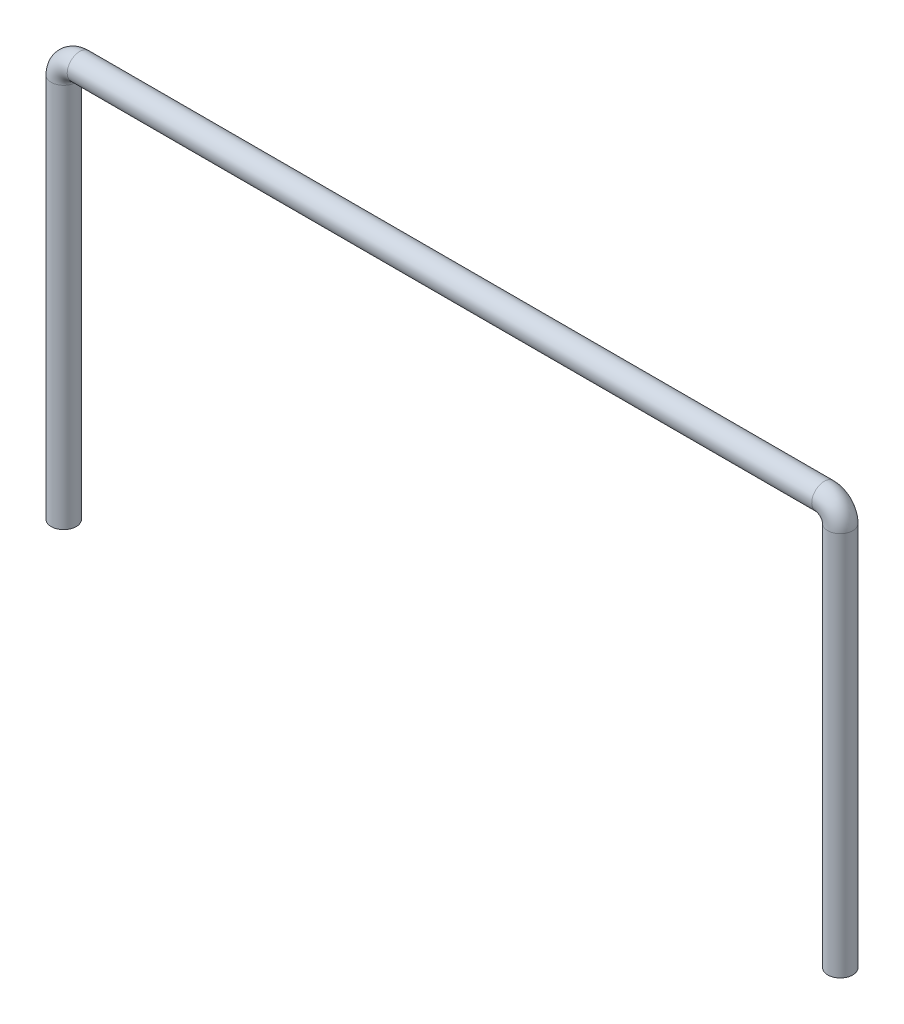
ISO-10303-21;
HEADER;
FILE_DESCRIPTION(('STEP AP214'),'2;1');
FILE_NAME('part.step','',(''),(''),'','','');
FILE_SCHEMA(('AUTOMOTIVE_DESIGN { 1 0 10303 214 1 1 1 1 }'));
ENDSEC;
DATA;
#1=APPLICATION_CONTEXT('core data for automotive mechanical design processes');
#2=APPLICATION_PROTOCOL_DEFINITION('international standard','automotive_design',2000,#1);
#3=PRODUCT_CONTEXT('',#1,'mechanical');
#4=PRODUCT('Part','Part','',(#3));
#5=PRODUCT_RELATED_PRODUCT_CATEGORY('part','',(#4));
#6=PRODUCT_DEFINITION_FORMATION('','',#4);
#7=PRODUCT_DEFINITION_CONTEXT('part definition',#1,'design');
#8=PRODUCT_DEFINITION('design','',#6,#7);
#9=PRODUCT_DEFINITION_SHAPE('','',#8);
#10=(LENGTH_UNIT() NAMED_UNIT(*) SI_UNIT(.MILLI.,.METRE.));
#11=(NAMED_UNIT(*) PLANE_ANGLE_UNIT() SI_UNIT($,.RADIAN.));
#12=(NAMED_UNIT(*) SI_UNIT($,.STERADIAN.) SOLID_ANGLE_UNIT());
#13=UNCERTAINTY_MEASURE_WITH_UNIT(LENGTH_MEASURE(1.E-05),#10,'distance_accuracy_value','');
#14=(GEOMETRIC_REPRESENTATION_CONTEXT(3) GLOBAL_UNCERTAINTY_ASSIGNED_CONTEXT((#13)) GLOBAL_UNIT_ASSIGNED_CONTEXT((#10,
#11,#12)) REPRESENTATION_CONTEXT('',''));
#15=CARTESIAN_POINT('',(0.,0.,0.));
#16=DIRECTION('',(0.,0.,1.));
#17=DIRECTION('',(1.,0.,0.));
#18=AXIS2_PLACEMENT_3D('',#15,#16,#17);
#19=CARTESIAN_POINT('',(-6.1515625,-6.35,0.));
#20=DIRECTION('',(0.,1.,0.));
#21=DIRECTION('',(0.,0.,1.));
#22=AXIS2_PLACEMENT_3D('',#19,#20,#21);
#23=PLANE('',#22);
#24=CARTESIAN_POINT('',(-6.1515625,-6.35,0.));
#25=DIRECTION('',(0.,1.,0.));
#26=DIRECTION('',(0.,0.,1.));
#27=AXIS2_PLACEMENT_3D('',#24,#25,#26);
#28=CIRCLE('',#27,0.1984375);
#29=CARTESIAN_POINT('',(-6.1515625,-6.35,0.1984375));
#30=VERTEX_POINT('',#29);
#31=EDGE_CURVE('E53',#30,#30,#28,.T.);
#32=ORIENTED_EDGE('',*,*,#31,.F.);
#33=EDGE_LOOP('',(#32));
#34=FACE_BOUND('',#33,.T.);
#35=ADVANCED_FACE('F31',(#34),#23,.F.);
#36=CARTESIAN_POINT('',(6.1515625,-6.35,0.));
#37=DIRECTION('',(0.,-1.,0.));
#38=DIRECTION('',(0.,0.,1.));
#39=AXIS2_PLACEMENT_3D('',#36,#37,#38);
#40=PLANE('',#39);
#41=CARTESIAN_POINT('',(6.1515625,-6.35,0.));
#42=DIRECTION('',(0.,-1.,0.));
#43=DIRECTION('',(0.,0.,1.));
#44=AXIS2_PLACEMENT_3D('',#41,#42,#43);
#45=CIRCLE('',#44,0.1984375);
#46=CARTESIAN_POINT('',(6.1515625,-6.35,0.1984375));
#47=VERTEX_POINT('',#46);
#48=EDGE_CURVE('E10',#47,#47,#45,.T.);
#49=ORIENTED_EDGE('',*,*,#48,.T.);
#50=EDGE_LOOP('',(#49));
#51=FACE_BOUND('',#50,.T.);
#52=ADVANCED_FACE('F60',(#51),#40,.T.);
#53=CARTESIAN_POINT('',(-6.1515625,-6.35,0.));
#54=DIRECTION('',(0.,1.,0.));
#55=DIRECTION('',(0.,0.,1.));
#56=AXIS2_PLACEMENT_3D('',#53,#54,#55);
#57=CYLINDRICAL_SURFACE('',#56,0.1984375);
#58=CARTESIAN_POINT('',(-6.1515625,-0.254000000000002,0.));
#59=DIRECTION('',(0.,1.,0.));
#60=DIRECTION('',(0.,0.,1.));
#61=AXIS2_PLACEMENT_3D('',#58,#59,#60);
#62=CIRCLE('',#61,0.1984375);
#63=CARTESIAN_POINT('',(-6.35,-0.254000000000002,0.));
#64=VERTEX_POINT('',#63);
#65=EDGE_CURVE('E50',#64,#64,#62,.T.);
#66=ORIENTED_EDGE('',*,*,#65,.F.);
#67=EDGE_LOOP('',(#66));
#68=FACE_BOUND('',#67,.T.);
#69=ORIENTED_EDGE('',*,*,#31,.T.);
#70=EDGE_LOOP('',(#69));
#71=FACE_BOUND('',#70,.T.);
#72=ADVANCED_FACE('F57',(#68,#71),#57,.T.);
#73=CARTESIAN_POINT('',(-5.8975625,-0.254000000000001,0.));
#74=DIRECTION('',(0.,0.,-1.));
#75=DIRECTION('',(-1.,0.,0.));
#76=AXIS2_PLACEMENT_3D('',#73,#74,#75);
#77=TOROIDAL_SURFACE('',#76,0.253999999999998,0.1984375);
#78=CARTESIAN_POINT('',(-5.8975625,0.,0.));
#79=DIRECTION('',(1.,0.,0.));
#80=DIRECTION('',(0.,0.,1.));
#81=AXIS2_PLACEMENT_3D('',#78,#79,#80);
#82=CIRCLE('',#81,0.1984375);
#83=CARTESIAN_POINT('',(-5.8975625,0.198437499999997,0.));
#84=VERTEX_POINT('',#83);
#85=EDGE_CURVE('E45',#84,#84,#82,.T.);
#86=CARTESIAN_POINT('',(-5.8975625,-0.254000000000001,0.));
#87=DIRECTION('',(0.,0.,-1.));
#88=DIRECTION('',(-1.,0.,0.));
#89=AXIS2_PLACEMENT_3D('',#86,#87,#88);
#90=CIRCLE('',#89,0.452437499999998);
#91=EDGE_CURVE('',#64,#84,#90,.T.);
#92=ORIENTED_EDGE('',*,*,#65,.T.);
#93=ORIENTED_EDGE('',*,*,#85,.F.);
#94=ORIENTED_EDGE('',*,*,#91,.T.);
#95=ORIENTED_EDGE('',*,*,#91,.F.);
#96=EDGE_LOOP('',(#92,#94,#93,#95));
#97=FACE_BOUND('',#96,.T.);
#98=ADVANCED_FACE('F78',(#97),#77,.T.);
#99=CARTESIAN_POINT('',(-5.8975625,0.,0.));
#100=DIRECTION('',(1.,0.,0.));
#101=DIRECTION('',(0.,0.,-1.));
#102=AXIS2_PLACEMENT_3D('',#99,#100,#101);
#103=CYLINDRICAL_SURFACE('',#102,0.1984375);
#104=CARTESIAN_POINT('',(5.8975625,0.,0.));
#105=DIRECTION('',(1.,0.,0.));
#106=DIRECTION('',(0.,0.,1.));
#107=AXIS2_PLACEMENT_3D('',#104,#105,#106);
#108=CIRCLE('',#107,0.1984375);
#109=CARTESIAN_POINT('',(5.8975625,0.198437499999998,0.));
#110=VERTEX_POINT('',#109);
#111=EDGE_CURVE('E41',#110,#110,#108,.T.);
#112=ORIENTED_EDGE('',*,*,#111,.F.);
#113=EDGE_LOOP('',(#112));
#114=FACE_BOUND('',#113,.T.);
#115=ORIENTED_EDGE('',*,*,#85,.T.);
#116=EDGE_LOOP('',(#115));
#117=FACE_BOUND('',#116,.T.);
#118=ADVANCED_FACE('F72',(#114,#117),#103,.T.);
#119=CARTESIAN_POINT('',(5.8975625,-0.254000000000001,0.));
#120=DIRECTION('',(0.,0.,-1.));
#121=DIRECTION('',(-1.,0.,0.));
#122=AXIS2_PLACEMENT_3D('',#119,#120,#121);
#123=TOROIDAL_SURFACE('',#122,0.254,0.1984375);
#124=CARTESIAN_POINT('',(6.1515625,-0.254000000000002,0.));
#125=DIRECTION('',(0.,-1.,0.));
#126=DIRECTION('',(0.,0.,1.));
#127=AXIS2_PLACEMENT_3D('',#124,#125,#126);
#128=CIRCLE('',#127,0.1984375);
#129=CARTESIAN_POINT('',(6.35,-0.254000000000002,0.));
#130=VERTEX_POINT('',#129);
#131=EDGE_CURVE('E37',#130,#130,#128,.T.);
#132=CARTESIAN_POINT('',(5.8975625,-0.254000000000001,0.));
#133=DIRECTION('',(0.,0.,-1.));
#134=DIRECTION('',(-1.,0.,0.));
#135=AXIS2_PLACEMENT_3D('',#132,#133,#134);
#136=CIRCLE('',#135,0.4524375);
#137=EDGE_CURVE('',#110,#130,#136,.T.);
#138=ORIENTED_EDGE('',*,*,#111,.T.);
#139=ORIENTED_EDGE('',*,*,#131,.F.);
#140=ORIENTED_EDGE('',*,*,#137,.T.);
#141=ORIENTED_EDGE('',*,*,#137,.F.);
#142=EDGE_LOOP('',(#138,#140,#139,#141));
#143=FACE_BOUND('',#142,.T.);
#144=ADVANCED_FACE('F66',(#143),#123,.T.);
#145=CARTESIAN_POINT('',(6.1515625,-0.254000000000002,0.));
#146=DIRECTION('',(0.,-1.,0.));
#147=DIRECTION('',(0.,0.,-1.));
#148=AXIS2_PLACEMENT_3D('',#145,#146,#147);
#149=CYLINDRICAL_SURFACE('',#148,0.1984375);
#150=ORIENTED_EDGE('',*,*,#48,.F.);
#151=EDGE_LOOP('',(#150));
#152=FACE_BOUND('',#151,.T.);
#153=ORIENTED_EDGE('',*,*,#131,.T.);
#154=EDGE_LOOP('',(#153));
#155=FACE_BOUND('',#154,.T.);
#156=ADVANCED_FACE('F64',(#152,#155),#149,.T.);
#157=CLOSED_SHELL('',(#35,#52,#72,#98,#118,#144,#156));
#158=MANIFOLD_SOLID_BREP('B2',#157);
#159=ADVANCED_BREP_SHAPE_REPRESENTATION('',(#18,#158),#14);
#160=SHAPE_DEFINITION_REPRESENTATION(#9,#159);
ENDSEC;
END-ISO-10303-21;
